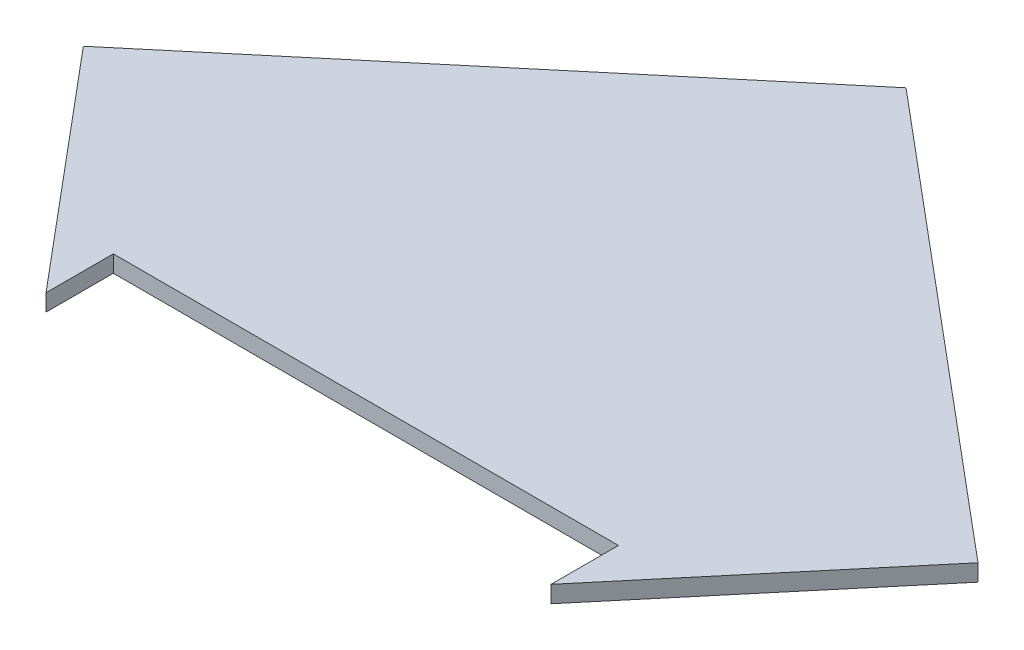
ISO-10303-21;
HEADER;
FILE_DESCRIPTION(('STEP AP214'),'2;1');
FILE_NAME('part.step','',(''),(''),'','','');
FILE_SCHEMA(('AUTOMOTIVE_DESIGN { 1 0 10303 214 1 1 1 1 }'));
ENDSEC;
DATA;
#1=APPLICATION_CONTEXT('core data for automotive mechanical design processes');
#2=APPLICATION_PROTOCOL_DEFINITION('international standard','automotive_design',2000,#1);
#3=PRODUCT_CONTEXT('',#1,'mechanical');
#4=PRODUCT('Part','Part','',(#3));
#5=PRODUCT_RELATED_PRODUCT_CATEGORY('part','',(#4));
#6=PRODUCT_DEFINITION_FORMATION('','',#4);
#7=PRODUCT_DEFINITION_CONTEXT('part definition',#1,'design');
#8=PRODUCT_DEFINITION('design','',#6,#7);
#9=PRODUCT_DEFINITION_SHAPE('','',#8);
#10=(LENGTH_UNIT() NAMED_UNIT(*) SI_UNIT(.MILLI.,.METRE.));
#11=(NAMED_UNIT(*) PLANE_ANGLE_UNIT() SI_UNIT($,.RADIAN.));
#12=(NAMED_UNIT(*) SI_UNIT($,.STERADIAN.) SOLID_ANGLE_UNIT());
#13=UNCERTAINTY_MEASURE_WITH_UNIT(LENGTH_MEASURE(1.E-05),#10,'distance_accuracy_value','');
#14=(GEOMETRIC_REPRESENTATION_CONTEXT(3) GLOBAL_UNCERTAINTY_ASSIGNED_CONTEXT((#13)) GLOBAL_UNIT_ASSIGNED_CONTEXT((#10,
#11,#12)) REPRESENTATION_CONTEXT('',''));
#15=CARTESIAN_POINT('',(0.,0.,0.));
#16=DIRECTION('',(0.,0.,1.));
#17=DIRECTION('',(1.,0.,0.));
#18=AXIS2_PLACEMENT_3D('',#15,#16,#17);
#19=CARTESIAN_POINT('',(-95.25,6.35,0.));
#20=DIRECTION('',(-1.,0.,0.));
#21=DIRECTION('',(0.,0.,1.));
#22=AXIS2_PLACEMENT_3D('',#19,#20,#21);
#23=PLANE('',#22);
#24=DIRECTION('',(0.,0.,-1.));
#25=VECTOR('',#24,1.);
#26=CARTESIAN_POINT('',(-95.25,0.,0.));
#27=LINE('',#26,#25);
#28=CARTESIAN_POINT('',(-95.25,0.,25.4));
#29=VERTEX_POINT('',#28);
#30=CARTESIAN_POINT('',(-95.25,0.,0.));
#31=VERTEX_POINT('',#30);
#32=EDGE_CURVE('E123',#29,#31,#27,.T.);
#33=ORIENTED_EDGE('',*,*,#32,.T.);
#34=DIRECTION('',(0.,-1.,0.));
#35=VECTOR('',#34,1.);
#36=CARTESIAN_POINT('',(-95.25,6.35,0.));
#37=LINE('',#36,#35);
#38=CARTESIAN_POINT('',(-95.25,6.35,0.));
#39=VERTEX_POINT('',#38);
#40=EDGE_CURVE('E11',#39,#31,#37,.T.);
#41=ORIENTED_EDGE('',*,*,#40,.F.);
#42=DIRECTION('',(0.,0.,-1.));
#43=VECTOR('',#42,1.);
#44=CARTESIAN_POINT('',(-95.25,6.35,0.));
#45=LINE('',#44,#43);
#46=CARTESIAN_POINT('',(-95.25,6.35,25.4));
#47=VERTEX_POINT('',#46);
#48=EDGE_CURVE('E135',#47,#39,#45,.T.);
#49=ORIENTED_EDGE('',*,*,#48,.F.);
#50=DIRECTION('',(0.,-1.,0.));
#51=VECTOR('',#50,1.);
#52=CARTESIAN_POINT('',(-95.25,6.35,25.4));
#53=LINE('',#52,#51);
#54=EDGE_CURVE('E119',#47,#29,#53,.T.);
#55=ORIENTED_EDGE('',*,*,#54,.T.);
#56=EDGE_LOOP('',(#33,#41,#49,#55));
#57=FACE_BOUND('',#56,.T.);
#58=ADVANCED_FACE('F33',(#57),#23,.F.);
#59=CARTESIAN_POINT('',(-95.25,6.35,0.));
#60=DIRECTION('',(0.,0.,-1.));
#61=DIRECTION('',(-1.,0.,0.));
#62=AXIS2_PLACEMENT_3D('',#59,#60,#61);
#63=PLANE('',#62);
#64=DIRECTION('',(1.,0.,0.));
#65=VECTOR('',#64,1.);
#66=CARTESIAN_POINT('',(-95.25,0.,0.));
#67=LINE('',#66,#65);
#68=CARTESIAN_POINT('',(95.25,0.,0.));
#69=VERTEX_POINT('',#68);
#70=EDGE_CURVE('E126',#31,#69,#67,.T.);
#71=ORIENTED_EDGE('',*,*,#70,.T.);
#72=DIRECTION('',(0.,-1.,0.));
#73=VECTOR('',#72,1.);
#74=CARTESIAN_POINT('',(95.25,6.35,0.));
#75=LINE('',#74,#73);
#76=CARTESIAN_POINT('',(95.25,6.35,0.));
#77=VERTEX_POINT('',#76);
#78=EDGE_CURVE('E41',#77,#69,#75,.T.);
#79=ORIENTED_EDGE('',*,*,#78,.F.);
#80=DIRECTION('',(1.,0.,0.));
#81=VECTOR('',#80,1.);
#82=CARTESIAN_POINT('',(-95.25,6.35,0.));
#83=LINE('',#82,#81);
#84=EDGE_CURVE('E89',#39,#77,#83,.T.);
#85=ORIENTED_EDGE('',*,*,#84,.F.);
#86=ORIENTED_EDGE('',*,*,#40,.T.);
#87=EDGE_LOOP('',(#71,#79,#85,#86));
#88=FACE_BOUND('',#87,.T.);
#89=ADVANCED_FACE('F160',(#88),#63,.F.);
#90=CARTESIAN_POINT('',(95.25,6.35,0.));
#91=DIRECTION('',(1.,0.,0.));
#92=DIRECTION('',(0.,0.,-1.));
#93=AXIS2_PLACEMENT_3D('',#90,#91,#92);
#94=PLANE('',#93);
#95=DIRECTION('',(0.,0.,1.));
#96=VECTOR('',#95,1.);
#97=CARTESIAN_POINT('',(95.25,0.,0.));
#98=LINE('',#97,#96);
#99=CARTESIAN_POINT('',(95.25,0.,25.4));
#100=VERTEX_POINT('',#99);
#101=EDGE_CURVE('E128',#69,#100,#98,.T.);
#102=ORIENTED_EDGE('',*,*,#101,.T.);
#103=DIRECTION('',(0.,-1.,0.));
#104=VECTOR('',#103,1.);
#105=CARTESIAN_POINT('',(95.25,6.35,25.4));
#106=LINE('',#105,#104);
#107=CARTESIAN_POINT('',(95.25,6.35,25.4));
#108=VERTEX_POINT('',#107);
#109=EDGE_CURVE('E139',#108,#100,#106,.T.);
#110=ORIENTED_EDGE('',*,*,#109,.F.);
#111=DIRECTION('',(0.,0.,1.));
#112=VECTOR('',#111,1.);
#113=CARTESIAN_POINT('',(95.25,6.35,0.));
#114=LINE('',#113,#112);
#115=EDGE_CURVE('E147',#77,#108,#114,.T.);
#116=ORIENTED_EDGE('',*,*,#115,.F.);
#117=ORIENTED_EDGE('',*,*,#78,.T.);
#118=EDGE_LOOP('',(#102,#110,#116,#117));
#119=FACE_BOUND('',#118,.T.);
#120=ADVANCED_FACE('F145',(#119),#94,.F.);
#121=CARTESIAN_POINT('',(95.25,6.35,25.4));
#122=DIRECTION('',(-0.766044443118982,0.,-0.642787609686535));
#123=DIRECTION('',(-0.642787609686535,0.,0.766044443118982));
#124=AXIS2_PLACEMENT_3D('',#121,#122,#123);
#125=PLANE('',#124);
#126=DIRECTION('',(0.642787609686535,0.,-0.766044443118982));
#127=VECTOR('',#126,1.);
#128=CARTESIAN_POINT('',(95.25,0.,25.4));
#129=LINE('',#128,#127);
#130=CARTESIAN_POINT('',(168.720623787171,0.,-62.1588798484997));
#131=VERTEX_POINT('',#130);
#132=EDGE_CURVE('E130',#100,#131,#129,.T.);
#133=ORIENTED_EDGE('',*,*,#132,.T.);
#134=DIRECTION('',(0.,-1.,0.));
#135=VECTOR('',#134,1.);
#136=CARTESIAN_POINT('',(168.720623787171,6.35,-62.1588798484997));
#137=LINE('',#136,#135);
#138=CARTESIAN_POINT('',(168.720623787171,6.35,-62.1588798484997));
#139=VERTEX_POINT('',#138);
#140=EDGE_CURVE('E114',#139,#131,#137,.T.);
#141=ORIENTED_EDGE('',*,*,#140,.F.);
#142=DIRECTION('',(0.642787609686535,0.,-0.766044443118982));
#143=VECTOR('',#142,1.);
#144=CARTESIAN_POINT('',(95.25,6.35,25.4));
#145=LINE('',#144,#143);
#146=EDGE_CURVE('E105',#108,#139,#145,.T.);
#147=ORIENTED_EDGE('',*,*,#146,.F.);
#148=ORIENTED_EDGE('',*,*,#109,.T.);
#149=EDGE_LOOP('',(#133,#141,#147,#148));
#150=FACE_BOUND('',#149,.T.);
#151=ADVANCED_FACE('F153',(#150),#125,.F.);
#152=CARTESIAN_POINT('',(0.,6.35,-203.732293040315));
#153=DIRECTION('',(-0.642787609686537,0.,0.76604444311898));
#154=DIRECTION('',(0.76604444311898,0.,0.642787609686537));
#155=AXIS2_PLACEMENT_3D('',#152,#153,#154);
#156=PLANE('',#155);
#157=DIRECTION('',(-0.76604444311898,0.,-0.642787609686537));
#158=VECTOR('',#157,1.);
#159=CARTESIAN_POINT('',(0.,0.,-203.732293040315));
#160=LINE('',#159,#158);
#161=CARTESIAN_POINT('',(0.,0.,-203.732293040315));
#162=VERTEX_POINT('',#161);
#163=EDGE_CURVE('E113',#131,#162,#160,.T.);
#164=ORIENTED_EDGE('',*,*,#163,.T.);
#165=DIRECTION('',(0.,-1.,0.));
#166=VECTOR('',#165,1.);
#167=CARTESIAN_POINT('',(0.,6.35,-203.732293040315));
#168=LINE('',#167,#166);
#169=CARTESIAN_POINT('',(0.,6.35,-203.732293040315));
#170=VERTEX_POINT('',#169);
#171=EDGE_CURVE('E110',#170,#162,#168,.T.);
#172=ORIENTED_EDGE('',*,*,#171,.F.);
#173=DIRECTION('',(-0.76604444311898,0.,-0.642787609686537));
#174=VECTOR('',#173,1.);
#175=CARTESIAN_POINT('',(0.,6.35,-203.732293040315));
#176=LINE('',#175,#174);
#177=EDGE_CURVE('E99',#139,#170,#176,.T.);
#178=ORIENTED_EDGE('',*,*,#177,.F.);
#179=ORIENTED_EDGE('',*,*,#140,.T.);
#180=EDGE_LOOP('',(#164,#172,#178,#179));
#181=FACE_BOUND('',#180,.T.);
#182=ADVANCED_FACE('F111',(#181),#156,.F.);
#183=CARTESIAN_POINT('',(-168.720623787171,6.35,-62.1588798484996));
#184=DIRECTION('',(0.642787609686537,0.,0.766044443118979));
#185=DIRECTION('',(0.76604444311898,0.,-0.642787609686538));
#186=AXIS2_PLACEMENT_3D('',#183,#184,#185);
#187=PLANE('',#186);
#188=DIRECTION('',(-0.76604444311898,0.,0.642787609686537));
#189=VECTOR('',#188,1.);
#190=CARTESIAN_POINT('',(-168.720623787171,0.,-62.1588798484996));
#191=LINE('',#190,#189);
#192=CARTESIAN_POINT('',(-168.720623787171,0.,-62.1588798484996));
#193=VERTEX_POINT('',#192);
#194=EDGE_CURVE('E75',#162,#193,#191,.T.);
#195=ORIENTED_EDGE('',*,*,#194,.T.);
#196=DIRECTION('',(0.,-1.,0.));
#197=VECTOR('',#196,1.);
#198=CARTESIAN_POINT('',(-168.720623787171,6.35,-62.1588798484996));
#199=LINE('',#198,#197);
#200=CARTESIAN_POINT('',(-168.720623787171,6.35,-62.1588798484996));
#201=VERTEX_POINT('',#200);
#202=EDGE_CURVE('E115',#201,#193,#199,.T.);
#203=ORIENTED_EDGE('',*,*,#202,.F.);
#204=DIRECTION('',(-0.76604444311898,0.,0.642787609686537));
#205=VECTOR('',#204,1.);
#206=CARTESIAN_POINT('',(-168.720623787171,6.35,-62.1588798484996));
#207=LINE('',#206,#205);
#208=EDGE_CURVE('E103',#170,#201,#207,.T.);
#209=ORIENTED_EDGE('',*,*,#208,.F.);
#210=ORIENTED_EDGE('',*,*,#171,.T.);
#211=EDGE_LOOP('',(#195,#203,#209,#210));
#212=FACE_BOUND('',#211,.T.);
#213=ADVANCED_FACE('F117',(#212),#187,.F.);
#214=CARTESIAN_POINT('',(-95.25,6.35,25.4));
#215=DIRECTION('',(0.766044443118982,0.,-0.642787609686535));
#216=DIRECTION('',(-0.642787609686535,0.,-0.766044443118982));
#217=AXIS2_PLACEMENT_3D('',#214,#215,#216);
#218=PLANE('',#217);
#219=DIRECTION('',(0.642787609686535,0.,0.766044443118982));
#220=VECTOR('',#219,1.);
#221=CARTESIAN_POINT('',(-95.25,0.,25.4));
#222=LINE('',#221,#220);
#223=EDGE_CURVE('E81',#193,#29,#222,.T.);
#224=ORIENTED_EDGE('',*,*,#223,.T.);
#225=ORIENTED_EDGE('',*,*,#54,.F.);
#226=DIRECTION('',(0.642787609686535,0.,0.766044443118982));
#227=VECTOR('',#226,1.);
#228=CARTESIAN_POINT('',(-95.25,6.35,25.4));
#229=LINE('',#228,#227);
#230=EDGE_CURVE('E49',#201,#47,#229,.T.);
#231=ORIENTED_EDGE('',*,*,#230,.F.);
#232=ORIENTED_EDGE('',*,*,#202,.T.);
#233=EDGE_LOOP('',(#224,#225,#231,#232));
#234=FACE_BOUND('',#233,.T.);
#235=ADVANCED_FACE('F174',(#234),#218,.F.);
#236=CARTESIAN_POINT('',(0.,6.35,0.));
#237=DIRECTION('',(0.,1.,0.));
#238=DIRECTION('',(0.,0.,1.));
#239=AXIS2_PLACEMENT_3D('',#236,#237,#238);
#240=PLANE('',#239);
#241=ORIENTED_EDGE('',*,*,#48,.T.);
#242=ORIENTED_EDGE('',*,*,#84,.T.);
#243=ORIENTED_EDGE('',*,*,#115,.T.);
#244=ORIENTED_EDGE('',*,*,#146,.T.);
#245=ORIENTED_EDGE('',*,*,#177,.T.);
#246=ORIENTED_EDGE('',*,*,#208,.T.);
#247=ORIENTED_EDGE('',*,*,#230,.T.);
#248=EDGE_LOOP('',(#241,#242,#243,#244,#245,#246,#247));
#249=FACE_BOUND('',#248,.T.);
#250=ADVANCED_FACE('F101',(#249),#240,.T.);
#251=CARTESIAN_POINT('',(0.,0.,0.));
#252=DIRECTION('',(0.,1.,0.));
#253=DIRECTION('',(0.,0.,1.));
#254=AXIS2_PLACEMENT_3D('',#251,#252,#253);
#255=PLANE('',#254);
#256=ORIENTED_EDGE('',*,*,#32,.F.);
#257=ORIENTED_EDGE('',*,*,#223,.F.);
#258=ORIENTED_EDGE('',*,*,#194,.F.);
#259=ORIENTED_EDGE('',*,*,#163,.F.);
#260=ORIENTED_EDGE('',*,*,#132,.F.);
#261=ORIENTED_EDGE('',*,*,#101,.F.);
#262=ORIENTED_EDGE('',*,*,#70,.F.);
#263=EDGE_LOOP('',(#256,#257,#258,#259,#260,#261,#262));
#264=FACE_BOUND('',#263,.T.);
#265=ADVANCED_FACE('F151',(#264),#255,.F.);
#266=CLOSED_SHELL('',(#58,#89,#120,#151,#182,#213,#235,#250,#265));
#267=MANIFOLD_SOLID_BREP('B2',#266);
#268=ADVANCED_BREP_SHAPE_REPRESENTATION('',(#18,#267),#14);
#269=SHAPE_DEFINITION_REPRESENTATION(#9,#268);
ENDSEC;
END-ISO-10303-21;
